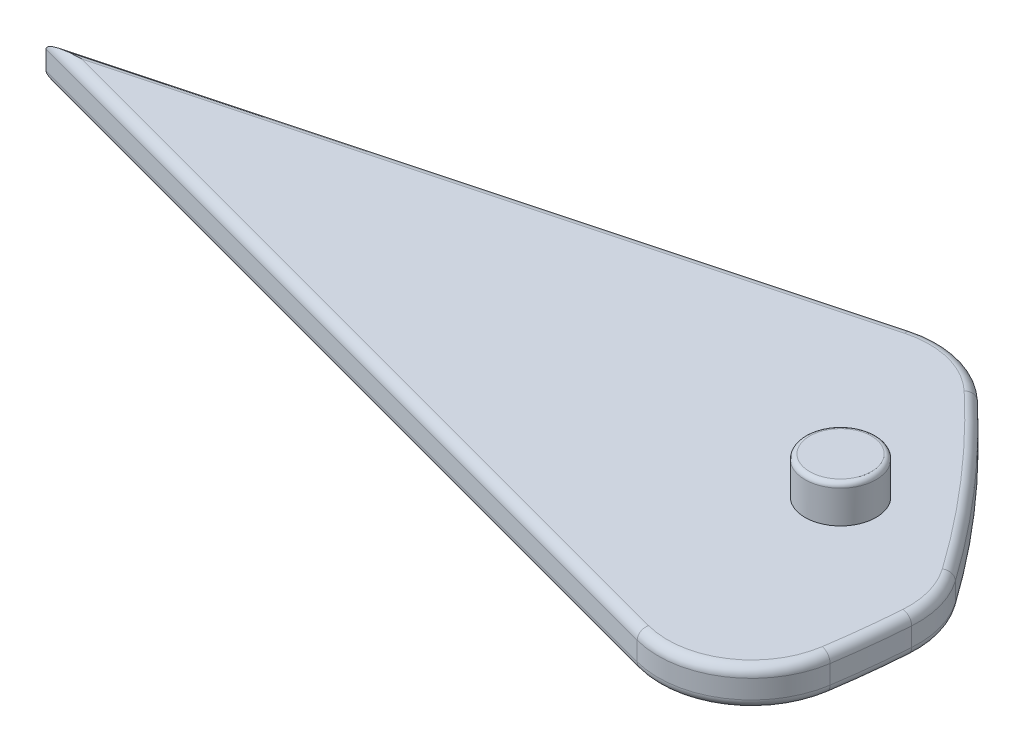
ISO-10303-21;
HEADER;
FILE_DESCRIPTION(('STEP AP214'),'2;1');
FILE_NAME('part.step','',(''),(''),'','','');
FILE_SCHEMA(('AUTOMOTIVE_DESIGN { 1 0 10303 214 1 1 1 1 }'));
ENDSEC;
DATA;
#1=APPLICATION_CONTEXT('core data for automotive mechanical design processes');
#2=APPLICATION_PROTOCOL_DEFINITION('international standard','automotive_design',2000,#1);
#3=PRODUCT_CONTEXT('',#1,'mechanical');
#4=PRODUCT('Part','Part','',(#3));
#5=PRODUCT_RELATED_PRODUCT_CATEGORY('part','',(#4));
#6=PRODUCT_DEFINITION_FORMATION('','',#4);
#7=PRODUCT_DEFINITION_CONTEXT('part definition',#1,'design');
#8=PRODUCT_DEFINITION('design','',#6,#7);
#9=PRODUCT_DEFINITION_SHAPE('','',#8);
#10=(LENGTH_UNIT() NAMED_UNIT(*) SI_UNIT(.MILLI.,.METRE.));
#11=(NAMED_UNIT(*) PLANE_ANGLE_UNIT() SI_UNIT($,.RADIAN.));
#12=(NAMED_UNIT(*) SI_UNIT($,.STERADIAN.) SOLID_ANGLE_UNIT());
#13=UNCERTAINTY_MEASURE_WITH_UNIT(LENGTH_MEASURE(1.E-05),#10,'distance_accuracy_value','');
#14=(GEOMETRIC_REPRESENTATION_CONTEXT(3) GLOBAL_UNCERTAINTY_ASSIGNED_CONTEXT((#13)) GLOBAL_UNIT_ASSIGNED_CONTEXT((#10,
#11,#12)) REPRESENTATION_CONTEXT('',''));
#15=CARTESIAN_POINT('',(0.,0.,0.));
#16=DIRECTION('',(0.,0.,1.));
#17=DIRECTION('',(1.,0.,0.));
#18=AXIS2_PLACEMENT_3D('',#15,#16,#17);
#19=CARTESIAN_POINT('',(0.,-1.,0.));
#20=DIRECTION('',(0.,-1.,0.));
#21=DIRECTION('',(0.,0.,-1.));
#22=AXIS2_PLACEMENT_3D('',#19,#20,#21);
#23=PLANE('',#22);
#24=DIRECTION('',(-0.965925826289068,0.,0.258819045102521));
#25=VECTOR('',#24,1.);
#26=CARTESIAN_POINT('',(36.6352093565327,-1.,-9.29873667142301));
#27=LINE('',#26,#25);
#28=CARTESIAN_POINT('',(1.93185165257814,-1.,0.));
#29=VERTEX_POINT('',#28);
#30=CARTESIAN_POINT('',(36.6352093565327,-1.,-9.29873667142301));
#31=VERTEX_POINT('',#30);
#32=EDGE_CURVE('E230',#29,#31,#27,.F.);
#33=ORIENTED_EDGE('',*,*,#32,.T.);
#34=CARTESIAN_POINT('',(37.799895059494,-1.,-4.95207045312221));
#35=DIRECTION('',(0.,-1.,0.));
#36=DIRECTION('',(0.,0.,-1.));
#37=AXIS2_PLACEMENT_3D('',#34,#35,#36);
#38=CIRCLE('',#37,4.5);
#39=CARTESIAN_POINT('',(40.8926137461799,-1.,-8.22087621746858));
#40=VERTEX_POINT('',#39);
#41=EDGE_CURVE('E242',#31,#40,#38,.T.);
#42=ORIENTED_EDGE('',*,*,#41,.T.);
#43=CARTESIAN_POINT('',(0.,-1.,35.));
#44=DIRECTION('',(0.,-1.,0.));
#45=DIRECTION('',(0.,0.,-1.));
#46=AXIS2_PLACEMENT_3D('',#43,#44,#45);
#47=CIRCLE('',#46,59.5);
#48=CARTESIAN_POINT('',(48.5574710612875,-1.,0.613636363636372));
#49=VERTEX_POINT('',#48);
#50=EDGE_CURVE('E240',#40,#49,#47,.T.);
#51=ORIENTED_EDGE('',*,*,#50,.T.);
#52=CARTESIAN_POINT('',(44.885057283543,-1.,3.21428571428573));
#53=DIRECTION('',(0.,-1.,0.));
#54=DIRECTION('',(0.,0.,-1.));
#55=AXIS2_PLACEMENT_3D('',#52,#53,#54);
#56=CIRCLE('',#55,4.5);
#57=CARTESIAN_POINT('',(49.3735630118973,-1.,3.5357142857143));
#58=VERTEX_POINT('',#57);
#59=EDGE_CURVE('E238',#49,#58,#56,.T.);
#60=ORIENTED_EDGE('',*,*,#59,.T.);
#61=CARTESIAN_POINT('',(0.,-1.,0.));
#62=DIRECTION('',(0.,-1.,0.));
#63=DIRECTION('',(0.,0.,-1.));
#64=AXIS2_PLACEMENT_3D('',#61,#62,#63);
#65=CIRCLE('',#64,49.5);
#66=CARTESIAN_POINT('',(48.9407725417741,-1.,7.41962148726819));
#67=VERTEX_POINT('',#66);
#68=EDGE_CURVE('E236',#58,#67,#65,.T.);
#69=ORIENTED_EDGE('',*,*,#68,.T.);
#70=CARTESIAN_POINT('',(44.4916114016128,-1.,6.74511044297109));
#71=DIRECTION('',(0.,-1.,0.));
#72=DIRECTION('',(0.,0.,-1.));
#73=AXIS2_PLACEMENT_3D('',#70,#71,#72);
#74=CIRCLE('',#73,4.5);
#75=CARTESIAN_POINT('',(43.3269256986515,-1.,11.0917766612719));
#76=VERTEX_POINT('',#75);
#77=EDGE_CURVE('E234',#67,#76,#74,.T.);
#78=ORIENTED_EDGE('',*,*,#77,.T.);
#79=DIRECTION('',(-0.965925826289068,0.,-0.258819045102521));
#80=VECTOR('',#79,1.);
#81=CARTESIAN_POINT('',(0.129409522551261,-1.,-0.482962913144534));
#82=LINE('',#81,#80);
#83=EDGE_CURVE('E232',#76,#29,#82,.T.);
#84=ORIENTED_EDGE('',*,*,#83,.T.);
#85=EDGE_LOOP('',(#33,#42,#51,#60,#69,#78,#84));
#86=FACE_BOUND('',#85,.T.);
#87=DIRECTION('',(0.,0.,-1.));
#88=VECTOR('',#87,1.);
#89=CARTESIAN_POINT('',(37.5,-1.,7.));
#90=LINE('',#89,#88);
#91=CARTESIAN_POINT('',(37.5,-1.,7.));
#92=VERTEX_POINT('',#91);
#93=CARTESIAN_POINT('',(37.5,-1.,-6.99999999999999));
#94=VERTEX_POINT('',#93);
#95=EDGE_CURVE('E681',#92,#94,#90,.T.);
#96=ORIENTED_EDGE('',*,*,#95,.F.);
#97=CARTESIAN_POINT('',(38.,-1.,7.));
#98=DIRECTION('',(0.,-1.,0.));
#99=DIRECTION('',(0.,0.,-1.));
#100=AXIS2_PLACEMENT_3D('',#97,#98,#99);
#101=CIRCLE('',#100,0.5);
#102=CARTESIAN_POINT('',(38.5,-1.,7.));
#103=VERTEX_POINT('',#102);
#104=EDGE_CURVE('E184',#103,#92,#101,.T.);
#105=ORIENTED_EDGE('',*,*,#104,.F.);
#106=DIRECTION('',(0.,0.,1.));
#107=VECTOR('',#106,1.);
#108=CARTESIAN_POINT('',(38.5,-1.,7.));
#109=LINE('',#108,#107);
#110=CARTESIAN_POINT('',(38.5,-1.,-6.99999999999999));
#111=VERTEX_POINT('',#110);
#112=EDGE_CURVE('E180',#111,#103,#109,.T.);
#113=ORIENTED_EDGE('',*,*,#112,.F.);
#114=CARTESIAN_POINT('',(38.,-1.,-6.99999999999999));
#115=DIRECTION('',(0.,-1.,0.));
#116=DIRECTION('',(0.,0.,-1.));
#117=AXIS2_PLACEMENT_3D('',#114,#115,#116);
#118=CIRCLE('',#117,0.5);
#119=EDGE_CURVE('E679',#94,#111,#118,.T.);
#120=ORIENTED_EDGE('',*,*,#119,.F.);
#121=EDGE_LOOP('',(#96,#105,#113,#120));
#122=FACE_BOUND('',#121,.T.);
#123=ADVANCED_FACE('F34',(#86,#122),#23,.T.);
#124=CARTESIAN_POINT('',(0.,1.,0.));
#125=DIRECTION('',(0.,-1.,0.));
#126=DIRECTION('',(0.,0.,-1.));
#127=AXIS2_PLACEMENT_3D('',#124,#125,#126);
#128=PLANE('',#127);
#129=CARTESIAN_POINT('',(42.5,1.,0.));
#130=DIRECTION('',(0.,-1.,0.));
#131=DIRECTION('',(0.,0.,-1.));
#132=AXIS2_PLACEMENT_3D('',#129,#130,#131);
#133=CIRCLE('',#132,1.9);
#134=CARTESIAN_POINT('',(42.5,1.,-1.9));
#135=VERTEX_POINT('',#134);
#136=EDGE_CURVE('E267',#135,#135,#133,.F.);
#137=ORIENTED_EDGE('',*,*,#136,.F.);
#138=EDGE_LOOP('',(#137));
#139=FACE_BOUND('',#138,.T.);
#140=CARTESIAN_POINT('',(0.,1.,35.));
#141=DIRECTION('',(0.,-1.,0.));
#142=DIRECTION('',(0.,0.,-1.));
#143=AXIS2_PLACEMENT_3D('',#140,#141,#142);
#144=CIRCLE('',#143,59.5);
#145=CARTESIAN_POINT('',(48.5574710612875,1.,0.613636363636372));
#146=VERTEX_POINT('',#145);
#147=CARTESIAN_POINT('',(40.8926137461799,1.,-8.22087621746858));
#148=VERTEX_POINT('',#147);
#149=EDGE_CURVE('E217',#146,#148,#144,.F.);
#150=ORIENTED_EDGE('',*,*,#149,.T.);
#151=CARTESIAN_POINT('',(37.799895059494,1.,-4.95207045312221));
#152=DIRECTION('',(0.,-1.,0.));
#153=DIRECTION('',(0.,0.,-1.));
#154=AXIS2_PLACEMENT_3D('',#151,#152,#153);
#155=CIRCLE('',#154,4.5);
#156=CARTESIAN_POINT('',(36.6352093565327,1.,-9.29873667142301));
#157=VERTEX_POINT('',#156);
#158=EDGE_CURVE('E221',#148,#157,#155,.F.);
#159=ORIENTED_EDGE('',*,*,#158,.T.);
#160=DIRECTION('',(-0.965925826289068,0.,0.258819045102521));
#161=VECTOR('',#160,1.);
#162=CARTESIAN_POINT('',(0.129409522551261,1.,0.482962913144534));
#163=LINE('',#162,#161);
#164=CARTESIAN_POINT('',(1.93185165257814,1.,0.));
#165=VERTEX_POINT('',#164);
#166=EDGE_CURVE('E219',#157,#165,#163,.T.);
#167=ORIENTED_EDGE('',*,*,#166,.T.);
#168=DIRECTION('',(-0.965925826289068,0.,-0.258819045102521));
#169=VECTOR('',#168,1.);
#170=CARTESIAN_POINT('',(43.3269256986515,1.,11.0917766612719));
#171=LINE('',#170,#169);
#172=CARTESIAN_POINT('',(43.3269256986515,1.,11.0917766612719));
#173=VERTEX_POINT('',#172);
#174=EDGE_CURVE('E209',#165,#173,#171,.F.);
#175=ORIENTED_EDGE('',*,*,#174,.T.);
#176=CARTESIAN_POINT('',(44.4916114016128,1.,6.74511044297109));
#177=DIRECTION('',(0.,-1.,0.));
#178=DIRECTION('',(0.,0.,-1.));
#179=AXIS2_PLACEMENT_3D('',#176,#177,#178);
#180=CIRCLE('',#179,4.5);
#181=CARTESIAN_POINT('',(48.9407725417741,1.,7.41962148726819));
#182=VERTEX_POINT('',#181);
#183=EDGE_CURVE('E211',#173,#182,#180,.F.);
#184=ORIENTED_EDGE('',*,*,#183,.T.);
#185=CARTESIAN_POINT('',(0.,1.,0.));
#186=DIRECTION('',(0.,-1.,0.));
#187=DIRECTION('',(0.,0.,-1.));
#188=AXIS2_PLACEMENT_3D('',#185,#186,#187);
#189=CIRCLE('',#188,49.5);
#190=CARTESIAN_POINT('',(49.3735630118973,1.,3.5357142857143));
#191=VERTEX_POINT('',#190);
#192=EDGE_CURVE('E213',#182,#191,#189,.F.);
#193=ORIENTED_EDGE('',*,*,#192,.T.);
#194=CARTESIAN_POINT('',(44.885057283543,1.,3.21428571428573));
#195=DIRECTION('',(0.,-1.,0.));
#196=DIRECTION('',(0.,0.,-1.));
#197=AXIS2_PLACEMENT_3D('',#194,#195,#196);
#198=CIRCLE('',#197,4.5);
#199=EDGE_CURVE('E215',#191,#146,#198,.F.);
#200=ORIENTED_EDGE('',*,*,#199,.T.);
#201=EDGE_LOOP('',(#150,#159,#167,#175,#184,#193,#200));
#202=FACE_BOUND('',#201,.T.);
#203=ADVANCED_FACE('F321',(#139,#202),#128,.F.);
#204=CARTESIAN_POINT('',(48.2962913144534,1.,-12.9409522551261));
#205=DIRECTION('',(0.258819045102521,0.,0.965925826289068));
#206=DIRECTION('',(0.965925826289068,0.,-0.258819045102521));
#207=AXIS2_PLACEMENT_3D('',#204,#205,#206);
#208=PLANE('',#207);
#209=DIRECTION('',(0.,-1.,0.));
#210=VECTOR('',#209,1.);
#211=CARTESIAN_POINT('',(36.5057998339814,-1.,-9.78169958456754));
#212=LINE('',#211,#210);
#213=CARTESIAN_POINT('',(36.5057998339814,0.5,-9.78169958456754));
#214=VERTEX_POINT('',#213);
#215=CARTESIAN_POINT('',(36.5057998339814,-0.5,-9.78169958456754));
#216=VERTEX_POINT('',#215);
#217=EDGE_CURVE('E188',#214,#216,#212,.T.);
#218=ORIENTED_EDGE('',*,*,#217,.T.);
#219=DIRECTION('',(-0.965925826289068,0.,0.258819045102521));
#220=VECTOR('',#219,1.);
#221=CARTESIAN_POINT('',(0.,-0.5,0.));
#222=LINE('',#221,#220);
#223=CARTESIAN_POINT('',(0.,-0.5,0.));
#224=VERTEX_POINT('',#223);
#225=EDGE_CURVE('E49',#216,#224,#222,.T.);
#226=ORIENTED_EDGE('',*,*,#225,.T.);
#227=DIRECTION('',(0.,-1.,0.));
#228=VECTOR('',#227,1.);
#229=CARTESIAN_POINT('',(0.,1.,0.));
#230=LINE('',#229,#228);
#231=CARTESIAN_POINT('',(0.,0.5,0.));
#232=VERTEX_POINT('',#231);
#233=EDGE_CURVE('E186',#232,#224,#230,.T.);
#234=ORIENTED_EDGE('',*,*,#233,.F.);
#235=DIRECTION('',(-0.965925826289068,0.,0.258819045102521));
#236=VECTOR('',#235,1.);
#237=CARTESIAN_POINT('',(48.2962913144534,0.5,-12.9409522551261));
#238=LINE('',#237,#236);
#239=EDGE_CURVE('E264',#232,#214,#238,.F.);
#240=ORIENTED_EDGE('',*,*,#239,.T.);
#241=EDGE_LOOP('',(#218,#226,#234,#240));
#242=FACE_BOUND('',#241,.T.);
#243=ADVANCED_FACE('F327',(#242),#208,.F.);
#244=CARTESIAN_POINT('',(48.2962913144534,1.,12.9409522551261));
#245=DIRECTION('',(-0.258819045102521,0.,0.965925826289068));
#246=DIRECTION('',(0.965925826289068,0.,0.258819045102521));
#247=AXIS2_PLACEMENT_3D('',#244,#245,#246);
#248=PLANE('',#247);
#249=ORIENTED_EDGE('',*,*,#233,.T.);
#250=DIRECTION('',(-0.965925826289068,0.,-0.258819045102521));
#251=VECTOR('',#250,1.);
#252=CARTESIAN_POINT('',(48.2962913144534,-0.5,12.9409522551261));
#253=LINE('',#252,#251);
#254=CARTESIAN_POINT('',(43.1975161761002,-0.5,11.5747395744164));
#255=VERTEX_POINT('',#254);
#256=EDGE_CURVE('E262',#224,#255,#253,.F.);
#257=ORIENTED_EDGE('',*,*,#256,.T.);
#258=DIRECTION('',(0.,-1.,0.));
#259=VECTOR('',#258,1.);
#260=CARTESIAN_POINT('',(43.1975161761002,1.,11.5747395744164));
#261=LINE('',#260,#259);
#262=CARTESIAN_POINT('',(43.1975161761002,0.5,11.5747395744164));
#263=VERTEX_POINT('',#262);
#264=EDGE_CURVE('E207',#255,#263,#261,.F.);
#265=ORIENTED_EDGE('',*,*,#264,.T.);
#266=DIRECTION('',(-0.965925826289068,0.,-0.258819045102521));
#267=VECTOR('',#266,1.);
#268=CARTESIAN_POINT('',(0.,0.5,0.));
#269=LINE('',#268,#267);
#270=EDGE_CURVE('E56',#263,#232,#269,.T.);
#271=ORIENTED_EDGE('',*,*,#270,.T.);
#272=EDGE_LOOP('',(#249,#257,#265,#271));
#273=FACE_BOUND('',#272,.T.);
#274=ADVANCED_FACE('F336',(#273),#248,.T.);
#275=CARTESIAN_POINT('',(0.,1.,0.));
#276=DIRECTION('',(0.,-1.,0.));
#277=DIRECTION('',(0.,0.,-1.));
#278=AXIS2_PLACEMENT_3D('',#275,#276,#277);
#279=CYLINDRICAL_SURFACE('',#278,50.);
#280=DIRECTION('',(0.,-1.,0.));
#281=VECTOR('',#280,1.);
#282=CARTESIAN_POINT('',(49.4351237795698,1.,7.49456715885676));
#283=LINE('',#282,#281);
#284=CARTESIAN_POINT('',(49.4351237795698,0.5,7.49456715885676));
#285=VERTEX_POINT('',#284);
#286=CARTESIAN_POINT('',(49.4351237795698,-0.5,7.49456715885676));
#287=VERTEX_POINT('',#286);
#288=EDGE_CURVE('E201',#285,#287,#283,.T.);
#289=ORIENTED_EDGE('',*,*,#288,.T.);
#290=CARTESIAN_POINT('',(0.,-0.5,0.));
#291=DIRECTION('',(0.,-1.,0.));
#292=DIRECTION('',(0.,0.,-1.));
#293=AXIS2_PLACEMENT_3D('',#290,#291,#292);
#294=CIRCLE('',#293,50.);
#295=CARTESIAN_POINT('',(49.8722858706034,-0.5,3.57142857142858));
#296=VERTEX_POINT('',#295);
#297=EDGE_CURVE('E255',#287,#296,#294,.F.);
#298=ORIENTED_EDGE('',*,*,#297,.T.);
#299=DIRECTION('',(0.,-1.,0.));
#300=VECTOR('',#299,1.);
#301=CARTESIAN_POINT('',(49.8722858706034,1.,3.57142857142858));
#302=LINE('',#301,#300);
#303=CARTESIAN_POINT('',(49.8722858706034,0.5,3.57142857142858));
#304=VERTEX_POINT('',#303);
#305=EDGE_CURVE('E204',#296,#304,#302,.F.);
#306=ORIENTED_EDGE('',*,*,#305,.T.);
#307=CARTESIAN_POINT('',(0.,0.5,0.));
#308=DIRECTION('',(0.,-1.,0.));
#309=DIRECTION('',(0.,0.,-1.));
#310=AXIS2_PLACEMENT_3D('',#307,#308,#309);
#311=CIRCLE('',#310,50.);
#312=EDGE_CURVE('E253',#304,#285,#311,.T.);
#313=ORIENTED_EDGE('',*,*,#312,.T.);
#314=EDGE_LOOP('',(#289,#298,#306,#313));
#315=FACE_BOUND('',#314,.T.);
#316=ADVANCED_FACE('F333',(#315),#279,.T.);
#317=CARTESIAN_POINT('',(38.,-2.,7.));
#318=DIRECTION('',(0.,1.,0.));
#319=DIRECTION('',(0.,0.,1.));
#320=AXIS2_PLACEMENT_3D('',#317,#318,#319);
#321=CYLINDRICAL_SURFACE('',#320,0.5);
#322=ORIENTED_EDGE('',*,*,#104,.T.);
#323=DIRECTION('',(0.,1.,0.));
#324=VECTOR('',#323,1.);
#325=CARTESIAN_POINT('',(37.5,-2.,7.));
#326=LINE('',#325,#324);
#327=CARTESIAN_POINT('',(37.5,-2.,7.));
#328=VERTEX_POINT('',#327);
#329=EDGE_CURVE('E164',#328,#92,#326,.T.);
#330=ORIENTED_EDGE('',*,*,#329,.F.);
#331=CARTESIAN_POINT('',(38.,-2.,7.));
#332=DIRECTION('',(0.,-1.,0.));
#333=DIRECTION('',(0.,0.,-1.));
#334=AXIS2_PLACEMENT_3D('',#331,#332,#333);
#335=CIRCLE('',#334,0.5);
#336=CARTESIAN_POINT('',(38.5,-2.,7.));
#337=VERTEX_POINT('',#336);
#338=EDGE_CURVE('E171',#337,#328,#335,.T.);
#339=ORIENTED_EDGE('',*,*,#338,.F.);
#340=DIRECTION('',(0.,1.,0.));
#341=VECTOR('',#340,1.);
#342=CARTESIAN_POINT('',(38.5,-2.,7.));
#343=LINE('',#342,#341);
#344=EDGE_CURVE('E686',#337,#103,#343,.T.);
#345=ORIENTED_EDGE('',*,*,#344,.T.);
#346=EDGE_LOOP('',(#322,#330,#339,#345));
#347=FACE_BOUND('',#346,.T.);
#348=ADVANCED_FACE('F182',(#347),#321,.T.);
#349=CARTESIAN_POINT('',(37.5,-2.,7.));
#350=DIRECTION('',(1.,0.,0.));
#351=DIRECTION('',(0.,0.,-1.));
#352=AXIS2_PLACEMENT_3D('',#349,#350,#351);
#353=PLANE('',#352);
#354=ORIENTED_EDGE('',*,*,#95,.T.);
#355=DIRECTION('',(0.,1.,0.));
#356=VECTOR('',#355,1.);
#357=CARTESIAN_POINT('',(37.5,-2.,-6.99999999999999));
#358=LINE('',#357,#356);
#359=CARTESIAN_POINT('',(37.5,-2.,-6.99999999999999));
#360=VERTEX_POINT('',#359);
#361=EDGE_CURVE('E167',#360,#94,#358,.T.);
#362=ORIENTED_EDGE('',*,*,#361,.F.);
#363=DIRECTION('',(0.,0.,-1.));
#364=VECTOR('',#363,1.);
#365=CARTESIAN_POINT('',(37.5,-2.,7.));
#366=LINE('',#365,#364);
#367=EDGE_CURVE('E160',#328,#360,#366,.T.);
#368=ORIENTED_EDGE('',*,*,#367,.F.);
#369=ORIENTED_EDGE('',*,*,#329,.T.);
#370=EDGE_LOOP('',(#354,#362,#368,#369));
#371=FACE_BOUND('',#370,.T.);
#372=ADVANCED_FACE('F162',(#371),#353,.F.);
#373=CARTESIAN_POINT('',(38.,-2.,-6.99999999999999));
#374=DIRECTION('',(0.,1.,0.));
#375=DIRECTION('',(0.,0.,1.));
#376=AXIS2_PLACEMENT_3D('',#373,#374,#375);
#377=CYLINDRICAL_SURFACE('',#376,0.5);
#378=ORIENTED_EDGE('',*,*,#119,.T.);
#379=DIRECTION('',(0.,1.,0.));
#380=VECTOR('',#379,1.);
#381=CARTESIAN_POINT('',(38.5,-2.,-6.99999999999999));
#382=LINE('',#381,#380);
#383=CARTESIAN_POINT('',(38.5,-2.,-6.99999999999999));
#384=VERTEX_POINT('',#383);
#385=EDGE_CURVE('E190',#384,#111,#382,.T.);
#386=ORIENTED_EDGE('',*,*,#385,.F.);
#387=CARTESIAN_POINT('',(38.,-2.,-6.99999999999999));
#388=DIRECTION('',(0.,-1.,0.));
#389=DIRECTION('',(0.,0.,-1.));
#390=AXIS2_PLACEMENT_3D('',#387,#388,#389);
#391=CIRCLE('',#390,0.5);
#392=EDGE_CURVE('E170',#360,#384,#391,.T.);
#393=ORIENTED_EDGE('',*,*,#392,.F.);
#394=ORIENTED_EDGE('',*,*,#361,.T.);
#395=EDGE_LOOP('',(#378,#386,#393,#394));
#396=FACE_BOUND('',#395,.T.);
#397=ADVANCED_FACE('F470',(#396),#377,.T.);
#398=CARTESIAN_POINT('',(38.5,-2.,7.));
#399=DIRECTION('',(-1.,0.,0.));
#400=DIRECTION('',(0.,0.,1.));
#401=AXIS2_PLACEMENT_3D('',#398,#399,#400);
#402=PLANE('',#401);
#403=ORIENTED_EDGE('',*,*,#112,.T.);
#404=ORIENTED_EDGE('',*,*,#344,.F.);
#405=DIRECTION('',(0.,0.,1.));
#406=VECTOR('',#405,1.);
#407=CARTESIAN_POINT('',(38.5,-2.,7.));
#408=LINE('',#407,#406);
#409=EDGE_CURVE('E176',#384,#337,#408,.T.);
#410=ORIENTED_EDGE('',*,*,#409,.F.);
#411=ORIENTED_EDGE('',*,*,#385,.T.);
#412=EDGE_LOOP('',(#403,#404,#410,#411));
#413=FACE_BOUND('',#412,.T.);
#414=ADVANCED_FACE('F464',(#413),#402,.F.);
#415=CARTESIAN_POINT('',(38.,-2.,7.));
#416=DIRECTION('',(0.,-1.,0.));
#417=DIRECTION('',(0.,0.,-1.));
#418=AXIS2_PLACEMENT_3D('',#415,#416,#417);
#419=PLANE('',#418);
#420=ORIENTED_EDGE('',*,*,#338,.T.);
#421=ORIENTED_EDGE('',*,*,#367,.T.);
#422=ORIENTED_EDGE('',*,*,#392,.T.);
#423=ORIENTED_EDGE('',*,*,#409,.T.);
#424=EDGE_LOOP('',(#420,#421,#422,#423));
#425=FACE_BOUND('',#424,.T.);
#426=ADVANCED_FACE('F174',(#425),#419,.T.);
#427=CARTESIAN_POINT('',(0.,-2.001,35.));
#428=DIRECTION('',(0.,1.,0.));
#429=DIRECTION('',(0.,0.,1.));
#430=AXIS2_PLACEMENT_3D('',#427,#428,#429);
#431=CYLINDRICAL_SURFACE('',#430,60.);
#432=DIRECTION('',(0.,1.,0.));
#433=VECTOR('',#432,1.);
#434=CARTESIAN_POINT('',(48.9655170365924,-2.001,0.324675324675332));
#435=LINE('',#434,#433);
#436=CARTESIAN_POINT('',(48.9655170365924,0.499999999999999,0.324675324675332));
#437=VERTEX_POINT('',#436);
#438=CARTESIAN_POINT('',(48.9655170365924,-0.5,0.324675324675332));
#439=VERTEX_POINT('',#438);
#440=EDGE_CURVE('E195',#437,#439,#435,.F.);
#441=ORIENTED_EDGE('',*,*,#440,.T.);
#442=CARTESIAN_POINT('',(0.,-0.5,35.));
#443=DIRECTION('',(0.,-1.,0.));
#444=DIRECTION('',(0.,0.,-1.));
#445=AXIS2_PLACEMENT_3D('',#442,#443,#444);
#446=CIRCLE('',#445,60.);
#447=CARTESIAN_POINT('',(41.2362491558116,-0.5,-8.5840768579515));
#448=VERTEX_POINT('',#447);
#449=EDGE_CURVE('E247',#439,#448,#446,.F.);
#450=ORIENTED_EDGE('',*,*,#449,.T.);
#451=DIRECTION('',(0.,1.,0.));
#452=VECTOR('',#451,1.);
#453=CARTESIAN_POINT('',(41.2362491558116,-2.001,-8.5840768579515));
#454=LINE('',#453,#452);
#455=CARTESIAN_POINT('',(41.2362491558116,0.499999999999999,-8.5840768579515));
#456=VERTEX_POINT('',#455);
#457=EDGE_CURVE('E198',#448,#456,#454,.T.);
#458=ORIENTED_EDGE('',*,*,#457,.T.);
#459=CARTESIAN_POINT('',(0.,0.5,35.));
#460=DIRECTION('',(0.,-1.,0.));
#461=DIRECTION('',(0.,0.,-1.));
#462=AXIS2_PLACEMENT_3D('',#459,#460,#461);
#463=CIRCLE('',#462,60.);
#464=EDGE_CURVE('E245',#456,#437,#463,.T.);
#465=ORIENTED_EDGE('',*,*,#464,.T.);
#466=EDGE_LOOP('',(#441,#450,#458,#465));
#467=FACE_BOUND('',#466,.T.);
#468=ADVANCED_FACE('F346',(#467),#431,.T.);
#469=CARTESIAN_POINT('',(37.799895059494,-2.001,-4.95207045312221));
#470=DIRECTION('',(0.,1.,0.));
#471=DIRECTION('',(0.,0.,1.));
#472=AXIS2_PLACEMENT_3D('',#469,#470,#471);
#473=CYLINDRICAL_SURFACE('',#472,5.);
#474=ORIENTED_EDGE('',*,*,#217,.F.);
#475=CARTESIAN_POINT('',(37.799895059494,0.5,-4.95207045312221));
#476=DIRECTION('',(0.,-1.,0.));
#477=DIRECTION('',(0.,0.,-1.));
#478=AXIS2_PLACEMENT_3D('',#475,#476,#477);
#479=CIRCLE('',#478,5.);
#480=EDGE_CURVE('E227',#214,#456,#479,.T.);
#481=ORIENTED_EDGE('',*,*,#480,.T.);
#482=ORIENTED_EDGE('',*,*,#457,.F.);
#483=CARTESIAN_POINT('',(37.799895059494,-0.5,-4.95207045312221));
#484=DIRECTION('',(0.,-1.,0.));
#485=DIRECTION('',(0.,0.,-1.));
#486=AXIS2_PLACEMENT_3D('',#483,#484,#485);
#487=CIRCLE('',#486,5.);
#488=EDGE_CURVE('E224',#448,#216,#487,.F.);
#489=ORIENTED_EDGE('',*,*,#488,.T.);
#490=EDGE_LOOP('',(#474,#481,#482,#489));
#491=FACE_BOUND('',#490,.T.);
#492=ADVANCED_FACE('F342',(#491),#473,.T.);
#493=CARTESIAN_POINT('',(44.885057283543,1.,3.21428571428573));
#494=DIRECTION('',(0.,-1.,0.));
#495=DIRECTION('',(0.,0.,-1.));
#496=AXIS2_PLACEMENT_3D('',#493,#494,#495);
#497=CYLINDRICAL_SURFACE('',#496,5.);
#498=ORIENTED_EDGE('',*,*,#305,.F.);
#499=CARTESIAN_POINT('',(44.885057283543,-0.5,3.21428571428573));
#500=DIRECTION('',(0.,-1.,0.));
#501=DIRECTION('',(0.,0.,-1.));
#502=AXIS2_PLACEMENT_3D('',#499,#500,#501);
#503=CIRCLE('',#502,5.);
#504=EDGE_CURVE('E251',#296,#439,#503,.F.);
#505=ORIENTED_EDGE('',*,*,#504,.T.);
#506=ORIENTED_EDGE('',*,*,#440,.F.);
#507=CARTESIAN_POINT('',(44.885057283543,0.5,3.21428571428573));
#508=DIRECTION('',(0.,-1.,0.));
#509=DIRECTION('',(0.,0.,-1.));
#510=AXIS2_PLACEMENT_3D('',#507,#508,#509);
#511=CIRCLE('',#510,5.);
#512=EDGE_CURVE('E249',#437,#304,#511,.T.);
#513=ORIENTED_EDGE('',*,*,#512,.T.);
#514=EDGE_LOOP('',(#498,#505,#506,#513));
#515=FACE_BOUND('',#514,.T.);
#516=ADVANCED_FACE('F345',(#515),#497,.T.);
#517=CARTESIAN_POINT('',(44.4916114016128,1.,6.74511044297109));
#518=DIRECTION('',(0.,-1.,0.));
#519=DIRECTION('',(0.,0.,-1.));
#520=AXIS2_PLACEMENT_3D('',#517,#518,#519);
#521=CYLINDRICAL_SURFACE('',#520,5.);
#522=ORIENTED_EDGE('',*,*,#264,.F.);
#523=CARTESIAN_POINT('',(44.4916114016128,-0.5,6.74511044297109));
#524=DIRECTION('',(0.,-1.,0.));
#525=DIRECTION('',(0.,0.,-1.));
#526=AXIS2_PLACEMENT_3D('',#523,#524,#525);
#527=CIRCLE('',#526,5.);
#528=EDGE_CURVE('E259',#255,#287,#527,.F.);
#529=ORIENTED_EDGE('',*,*,#528,.T.);
#530=ORIENTED_EDGE('',*,*,#288,.F.);
#531=CARTESIAN_POINT('',(44.4916114016128,0.5,6.74511044297109));
#532=DIRECTION('',(0.,-1.,0.));
#533=DIRECTION('',(0.,0.,-1.));
#534=AXIS2_PLACEMENT_3D('',#531,#532,#533);
#535=CIRCLE('',#534,5.);
#536=EDGE_CURVE('E257',#285,#263,#535,.T.);
#537=ORIENTED_EDGE('',*,*,#536,.T.);
#538=EDGE_LOOP('',(#522,#529,#530,#537));
#539=FACE_BOUND('',#538,.T.);
#540=ADVANCED_FACE('F350',(#539),#521,.T.);
#541=CARTESIAN_POINT('',(0.,0.5,0.));
#542=DIRECTION('',(0.,-1.,0.));
#543=DIRECTION('',(0.,0.,-1.));
#544=AXIS2_PLACEMENT_3D('',#541,#542,#543);
#545=TOROIDAL_SURFACE('',#544,49.5,0.5);
#546=CARTESIAN_POINT('',(49.3735630118973,0.5,3.5357142857143));
#547=DIRECTION('',(0.0714285714285716,0.,-0.997445717412067));
#548=DIRECTION('',(-0.997445717412067,0.,-0.0714285714285716));
#549=AXIS2_PLACEMENT_3D('',#546,#547,#548);
#550=CIRCLE('',#549,0.5);
#551=EDGE_CURVE('E282',#191,#304,#550,.T.);
#552=ORIENTED_EDGE('',*,*,#551,.F.);
#553=ORIENTED_EDGE('',*,*,#192,.F.);
#554=CARTESIAN_POINT('',(48.9407725417741,0.5,7.41962148726819));
#555=DIRECTION('',(-0.149891343177136,0.,0.988702475591396));
#556=DIRECTION('',(0.988702475591396,0.,0.149891343177136));
#557=AXIS2_PLACEMENT_3D('',#554,#555,#556);
#558=CIRCLE('',#557,0.5);
#559=EDGE_CURVE('E285',#285,#182,#558,.T.);
#560=ORIENTED_EDGE('',*,*,#559,.F.);
#561=ORIENTED_EDGE('',*,*,#312,.F.);
#562=EDGE_LOOP('',(#552,#553,#560,#561));
#563=FACE_BOUND('',#562,.T.);
#564=ADVANCED_FACE('F354',(#563),#545,.T.);
#565=CARTESIAN_POINT('',(44.4916114016128,0.5,6.74511044297109));
#566=DIRECTION('',(0.,-1.,0.));
#567=DIRECTION('',(0.,0.,-1.));
#568=AXIS2_PLACEMENT_3D('',#565,#566,#567);
#569=TOROIDAL_SURFACE('',#568,4.5,0.5);
#570=ORIENTED_EDGE('',*,*,#559,.T.);
#571=ORIENTED_EDGE('',*,*,#183,.F.);
#572=CARTESIAN_POINT('',(43.3269256986515,0.5,11.0917766612719));
#573=DIRECTION('',(-0.965925826289067,0.,-0.258819045102526));
#574=DIRECTION('',(-0.258819045102526,0.,0.965925826289067));
#575=AXIS2_PLACEMENT_3D('',#572,#573,#574);
#576=CIRCLE('',#575,0.5);
#577=EDGE_CURVE('E279',#263,#173,#576,.T.);
#578=ORIENTED_EDGE('',*,*,#577,.F.);
#579=ORIENTED_EDGE('',*,*,#536,.F.);
#580=EDGE_LOOP('',(#570,#571,#578,#579));
#581=FACE_BOUND('',#580,.T.);
#582=ADVANCED_FACE('F376',(#581),#569,.T.);
#583=CARTESIAN_POINT('',(44.885057283543,0.5,3.21428571428573));
#584=DIRECTION('',(0.,-1.,0.));
#585=DIRECTION('',(0.,0.,-1.));
#586=AXIS2_PLACEMENT_3D('',#583,#584,#585);
#587=TOROIDAL_SURFACE('',#586,4.5,0.5);
#588=ORIENTED_EDGE('',*,*,#551,.T.);
#589=ORIENTED_EDGE('',*,*,#512,.F.);
#590=CARTESIAN_POINT('',(48.5574710612875,0.5,0.613636363636372));
#591=DIRECTION('',(-0.577922077922077,0.,-0.816091950609874));
#592=DIRECTION('',(-0.816091950609874,0.,0.577922077922077));
#593=AXIS2_PLACEMENT_3D('',#590,#591,#592);
#594=CIRCLE('',#593,0.5);
#595=EDGE_CURVE('E276',#146,#437,#594,.T.);
#596=ORIENTED_EDGE('',*,*,#595,.F.);
#597=ORIENTED_EDGE('',*,*,#199,.F.);
#598=EDGE_LOOP('',(#588,#589,#596,#597));
#599=FACE_BOUND('',#598,.T.);
#600=ADVANCED_FACE('F372',(#599),#587,.T.);
#601=CARTESIAN_POINT('',(48.4257008370047,0.5,12.4579893419815));
#602=DIRECTION('',(0.965925826289068,0.,0.258819045102521));
#603=DIRECTION('',(0.258819045102521,0.,-0.965925826289068));
#604=AXIS2_PLACEMENT_3D('',#601,#602,#603);
#605=CYLINDRICAL_SURFACE('',#604,0.5);
#606=ORIENTED_EDGE('',*,*,#577,.T.);
#607=ORIENTED_EDGE('',*,*,#174,.F.);
#608=CARTESIAN_POINT('',(1.93185165257819,0.5,0.));
#609=DIRECTION('',(0.,0.,1.));
#610=DIRECTION('',(1.,0.,0.));
#611=AXIS2_PLACEMENT_3D('',#608,#609,#610);
#612=ELLIPSE('',#611,1.93185165257814,0.5);
#613=EDGE_CURVE('E273',#232,#165,#612,.F.);
#614=ORIENTED_EDGE('',*,*,#613,.F.);
#615=ORIENTED_EDGE('',*,*,#270,.F.);
#616=EDGE_LOOP('',(#606,#607,#614,#615));
#617=FACE_BOUND('',#616,.T.);
#618=ADVANCED_FACE('F368',(#617),#605,.T.);
#619=CARTESIAN_POINT('',(0.,0.5,35.));
#620=DIRECTION('',(0.,-1.,0.));
#621=DIRECTION('',(0.,0.,-1.));
#622=AXIS2_PLACEMENT_3D('',#619,#620,#621);
#623=TOROIDAL_SURFACE('',#622,59.5,0.5);
#624=ORIENTED_EDGE('',*,*,#595,.T.);
#625=ORIENTED_EDGE('',*,*,#464,.F.);
#626=CARTESIAN_POINT('',(40.8926137461799,0.5,-8.22087621746858));
#627=DIRECTION('',(-0.726401280965862,0.,-0.687270819263524));
#628=DIRECTION('',(-0.687270819263524,0.,0.726401280965862));
#629=AXIS2_PLACEMENT_3D('',#626,#627,#628);
#630=CIRCLE('',#629,0.5);
#631=EDGE_CURVE('E270',#148,#456,#630,.T.);
#632=ORIENTED_EDGE('',*,*,#631,.F.);
#633=ORIENTED_EDGE('',*,*,#149,.F.);
#634=EDGE_LOOP('',(#624,#625,#632,#633));
#635=FACE_BOUND('',#634,.T.);
#636=ADVANCED_FACE('F364',(#635),#623,.T.);
#637=CARTESIAN_POINT('',(0.129409522551261,0.5,0.482962913144534));
#638=DIRECTION('',(-0.965925826289068,0.,0.258819045102521));
#639=DIRECTION('',(0.258819045102521,0.,0.965925826289068));
#640=AXIS2_PLACEMENT_3D('',#637,#638,#639);
#641=CYLINDRICAL_SURFACE('',#640,0.5);
#642=ORIENTED_EDGE('',*,*,#613,.T.);
#643=ORIENTED_EDGE('',*,*,#166,.F.);
#644=CARTESIAN_POINT('',(36.6352093565327,0.5,-9.29873667142301));
#645=DIRECTION('',(0.965925826289067,0.,-0.258819045102526));
#646=DIRECTION('',(-0.258819045102526,0.,-0.965925826289067));
#647=AXIS2_PLACEMENT_3D('',#644,#645,#646);
#648=CIRCLE('',#647,0.5);
#649=EDGE_CURVE('E268',#214,#157,#648,.T.);
#650=ORIENTED_EDGE('',*,*,#649,.F.);
#651=ORIENTED_EDGE('',*,*,#239,.F.);
#652=EDGE_LOOP('',(#642,#643,#650,#651));
#653=FACE_BOUND('',#652,.T.);
#654=ADVANCED_FACE('F360',(#653),#641,.T.);
#655=CARTESIAN_POINT('',(37.799895059494,0.5,-4.95207045312221));
#656=DIRECTION('',(0.,-1.,0.));
#657=DIRECTION('',(0.,0.,-1.));
#658=AXIS2_PLACEMENT_3D('',#655,#656,#657);
#659=TOROIDAL_SURFACE('',#658,4.5,0.5);
#660=ORIENTED_EDGE('',*,*,#631,.T.);
#661=ORIENTED_EDGE('',*,*,#480,.F.);
#662=ORIENTED_EDGE('',*,*,#649,.T.);
#663=ORIENTED_EDGE('',*,*,#158,.F.);
#664=EDGE_LOOP('',(#660,#661,#662,#663));
#665=FACE_BOUND('',#664,.T.);
#666=ADVANCED_FACE('F356',(#665),#659,.T.);
#667=CARTESIAN_POINT('',(44.4916114016128,-0.5,6.74511044297109));
#668=DIRECTION('',(0.,-1.,0.));
#669=DIRECTION('',(0.,0.,-1.));
#670=AXIS2_PLACEMENT_3D('',#667,#668,#669);
#671=TOROIDAL_SURFACE('',#670,4.5,0.5);
#672=CARTESIAN_POINT('',(43.3269256986515,-0.5,11.0917766612719));
#673=DIRECTION('',(-0.965925826289067,0.,-0.258819045102526));
#674=DIRECTION('',(-0.258819045102526,0.,0.965925826289067));
#675=AXIS2_PLACEMENT_3D('',#672,#673,#674);
#676=CIRCLE('',#675,0.5);
#677=EDGE_CURVE('E301',#76,#255,#676,.T.);
#678=ORIENTED_EDGE('',*,*,#677,.F.);
#679=ORIENTED_EDGE('',*,*,#77,.F.);
#680=CARTESIAN_POINT('',(48.9407725417741,-0.5,7.41962148726819));
#681=DIRECTION('',(0.149891343177136,0.,-0.988702475591396));
#682=DIRECTION('',(-0.988702475591396,0.,-0.149891343177136));
#683=AXIS2_PLACEMENT_3D('',#680,#681,#682);
#684=CIRCLE('',#683,0.5);
#685=EDGE_CURVE('E271',#287,#67,#684,.T.);
#686=ORIENTED_EDGE('',*,*,#685,.F.);
#687=ORIENTED_EDGE('',*,*,#528,.F.);
#688=EDGE_LOOP('',(#678,#679,#686,#687));
#689=FACE_BOUND('',#688,.T.);
#690=ADVANCED_FACE('F359',(#689),#671,.T.);
#691=CARTESIAN_POINT('',(0.,-0.5,0.));
#692=DIRECTION('',(0.,-1.,0.));
#693=DIRECTION('',(0.,0.,-1.));
#694=AXIS2_PLACEMENT_3D('',#691,#692,#693);
#695=TOROIDAL_SURFACE('',#694,49.5,0.5);
#696=ORIENTED_EDGE('',*,*,#685,.T.);
#697=ORIENTED_EDGE('',*,*,#68,.F.);
#698=CARTESIAN_POINT('',(49.3735630118973,-0.5,3.5357142857143));
#699=DIRECTION('',(0.0714285714285708,0.,-0.997445717412067));
#700=DIRECTION('',(-0.997445717412067,0.,-0.0714285714285708));
#701=AXIS2_PLACEMENT_3D('',#698,#699,#700);
#702=CIRCLE('',#701,0.5);
#703=EDGE_CURVE('E298',#296,#58,#702,.T.);
#704=ORIENTED_EDGE('',*,*,#703,.F.);
#705=ORIENTED_EDGE('',*,*,#297,.F.);
#706=EDGE_LOOP('',(#696,#697,#704,#705));
#707=FACE_BOUND('',#706,.T.);
#708=ADVANCED_FACE('F403',(#707),#695,.T.);
#709=CARTESIAN_POINT('',(0.129409522551261,-0.5,-0.482962913144534));
#710=DIRECTION('',(-0.965925826289068,0.,-0.258819045102521));
#711=DIRECTION('',(-0.258819045102521,0.,0.965925826289068));
#712=AXIS2_PLACEMENT_3D('',#709,#710,#711);
#713=CYLINDRICAL_SURFACE('',#712,0.5);
#714=ORIENTED_EDGE('',*,*,#677,.T.);
#715=ORIENTED_EDGE('',*,*,#256,.F.);
#716=CARTESIAN_POINT('',(1.93185165257819,-0.5,0.));
#717=DIRECTION('',(0.,0.,-1.));
#718=DIRECTION('',(1.,0.,0.));
#719=AXIS2_PLACEMENT_3D('',#716,#717,#718);
#720=ELLIPSE('',#719,1.93185165257814,0.5);
#721=EDGE_CURVE('E295',#29,#224,#720,.T.);
#722=ORIENTED_EDGE('',*,*,#721,.F.);
#723=ORIENTED_EDGE('',*,*,#83,.F.);
#724=EDGE_LOOP('',(#714,#715,#722,#723));
#725=FACE_BOUND('',#724,.T.);
#726=ADVANCED_FACE('F399',(#725),#713,.T.);
#727=CARTESIAN_POINT('',(44.885057283543,-0.5,3.21428571428573));
#728=DIRECTION('',(0.,-1.,0.));
#729=DIRECTION('',(0.,0.,-1.));
#730=AXIS2_PLACEMENT_3D('',#727,#728,#729);
#731=TOROIDAL_SURFACE('',#730,4.5,0.5);
#732=ORIENTED_EDGE('',*,*,#703,.T.);
#733=ORIENTED_EDGE('',*,*,#59,.F.);
#734=CARTESIAN_POINT('',(48.5574710612875,-0.5,0.613636363636373));
#735=DIRECTION('',(-0.577922077922078,0.,-0.816091950609873));
#736=DIRECTION('',(-0.816091950609873,0.,0.577922077922078));
#737=AXIS2_PLACEMENT_3D('',#734,#735,#736);
#738=CIRCLE('',#737,0.5);
#739=EDGE_CURVE('E292',#439,#49,#738,.T.);
#740=ORIENTED_EDGE('',*,*,#739,.F.);
#741=ORIENTED_EDGE('',*,*,#504,.F.);
#742=EDGE_LOOP('',(#732,#733,#740,#741));
#743=FACE_BOUND('',#742,.T.);
#744=ADVANCED_FACE('F395',(#743),#731,.T.);
#745=CARTESIAN_POINT('',(48.4257008370047,-0.5,-12.4579893419815));
#746=DIRECTION('',(0.965925826289068,0.,-0.258819045102521));
#747=DIRECTION('',(-0.258819045102521,0.,-0.965925826289068));
#748=AXIS2_PLACEMENT_3D('',#745,#746,#747);
#749=CYLINDRICAL_SURFACE('',#748,0.5);
#750=ORIENTED_EDGE('',*,*,#721,.T.);
#751=ORIENTED_EDGE('',*,*,#225,.F.);
#752=CARTESIAN_POINT('',(36.6352093565327,-0.5,-9.29873667142301));
#753=DIRECTION('',(0.965925826289067,0.,-0.258819045102526));
#754=DIRECTION('',(-0.258819045102526,0.,-0.965925826289067));
#755=AXIS2_PLACEMENT_3D('',#752,#753,#754);
#756=CIRCLE('',#755,0.5);
#757=EDGE_CURVE('E290',#31,#216,#756,.T.);
#758=ORIENTED_EDGE('',*,*,#757,.F.);
#759=ORIENTED_EDGE('',*,*,#32,.F.);
#760=EDGE_LOOP('',(#750,#751,#758,#759));
#761=FACE_BOUND('',#760,.T.);
#762=ADVANCED_FACE('F391',(#761),#749,.T.);
#763=CARTESIAN_POINT('',(0.,-0.5,35.));
#764=DIRECTION('',(0.,-1.,0.));
#765=DIRECTION('',(0.,0.,-1.));
#766=AXIS2_PLACEMENT_3D('',#763,#764,#765);
#767=TOROIDAL_SURFACE('',#766,59.5,0.5);
#768=ORIENTED_EDGE('',*,*,#739,.T.);
#769=ORIENTED_EDGE('',*,*,#50,.F.);
#770=CARTESIAN_POINT('',(40.8926137461799,-0.5,-8.22087621746858));
#771=DIRECTION('',(-0.726401280965862,0.,-0.687270819263524));
#772=DIRECTION('',(-0.687270819263524,0.,0.726401280965862));
#773=AXIS2_PLACEMENT_3D('',#770,#771,#772);
#774=CIRCLE('',#773,0.5);
#775=EDGE_CURVE('E288',#448,#40,#774,.T.);
#776=ORIENTED_EDGE('',*,*,#775,.F.);
#777=ORIENTED_EDGE('',*,*,#449,.F.);
#778=EDGE_LOOP('',(#768,#769,#776,#777));
#779=FACE_BOUND('',#778,.T.);
#780=ADVANCED_FACE('F387',(#779),#767,.T.);
#781=CARTESIAN_POINT('',(37.799895059494,-0.5,-4.95207045312221));
#782=DIRECTION('',(0.,-1.,0.));
#783=DIRECTION('',(0.,0.,-1.));
#784=AXIS2_PLACEMENT_3D('',#781,#782,#783);
#785=TOROIDAL_SURFACE('',#784,4.5,0.5);
#786=ORIENTED_EDGE('',*,*,#757,.T.);
#787=ORIENTED_EDGE('',*,*,#488,.F.);
#788=ORIENTED_EDGE('',*,*,#775,.T.);
#789=ORIENTED_EDGE('',*,*,#41,.F.);
#790=EDGE_LOOP('',(#786,#787,#788,#789));
#791=FACE_BOUND('',#790,.T.);
#792=ADVANCED_FACE('F384',(#791),#785,.T.);
#793=CARTESIAN_POINT('',(42.5,3.,0.));
#794=DIRECTION('',(0.,-1.,0.));
#795=DIRECTION('',(0.,0.,-1.));
#796=AXIS2_PLACEMENT_3D('',#793,#794,#795);
#797=CYLINDRICAL_SURFACE('',#796,1.9);
#798=CARTESIAN_POINT('',(42.5,2.75,0.));
#799=DIRECTION('',(0.,1.,0.));
#800=DIRECTION('',(0.,0.,1.));
#801=AXIS2_PLACEMENT_3D('',#798,#799,#800);
#802=CIRCLE('',#801,1.9);
#803=CARTESIAN_POINT('',(42.5,2.75,1.9));
#804=VERTEX_POINT('',#803);
#805=EDGE_CURVE('E11',#804,#804,#802,.F.);
#806=ORIENTED_EDGE('',*,*,#805,.T.);
#807=EDGE_LOOP('',(#806));
#808=FACE_BOUND('',#807,.T.);
#809=ORIENTED_EDGE('',*,*,#136,.T.);
#810=EDGE_LOOP('',(#809));
#811=FACE_BOUND('',#810,.T.);
#812=ADVANCED_FACE('F317',(#808,#811),#797,.T.);
#813=CARTESIAN_POINT('',(42.5,3.,0.));
#814=DIRECTION('',(0.,1.,0.));
#815=DIRECTION('',(0.,0.,1.));
#816=AXIS2_PLACEMENT_3D('',#813,#814,#815);
#817=PLANE('',#816);
#818=CARTESIAN_POINT('',(42.5,3.,0.));
#819=DIRECTION('',(0.,1.,0.));
#820=DIRECTION('',(0.,0.,1.));
#821=AXIS2_PLACEMENT_3D('',#818,#819,#820);
#822=CIRCLE('',#821,1.65);
#823=CARTESIAN_POINT('',(42.5,3.,1.65));
#824=VERTEX_POINT('',#823);
#825=EDGE_CURVE('E42',#824,#824,#822,.T.);
#826=ORIENTED_EDGE('',*,*,#825,.T.);
#827=EDGE_LOOP('',(#826));
#828=FACE_BOUND('',#827,.T.);
#829=ADVANCED_FACE('F310',(#828),#817,.T.);
#830=CARTESIAN_POINT('',(42.5,2.75,0.));
#831=DIRECTION('',(0.,1.,0.));
#832=DIRECTION('',(0.,0.,1.));
#833=AXIS2_PLACEMENT_3D('',#830,#831,#832);
#834=TOROIDAL_SURFACE('',#833,1.65,0.25);
#835=ORIENTED_EDGE('',*,*,#805,.F.);
#836=EDGE_LOOP('',(#835));
#837=FACE_BOUND('',#836,.T.);
#838=ORIENTED_EDGE('',*,*,#825,.F.);
#839=EDGE_LOOP('',(#838));
#840=FACE_BOUND('',#839,.T.);
#841=ADVANCED_FACE('F36',(#837,#840),#834,.T.);
#842=CLOSED_SHELL('',(#123,#203,#243,#274,#316,#348,#372,#397,#414,#426,#468,#492,#516,#540,
#564,#582,#600,#618,#636,#654,#666,#690,#708,#726,#744,#762,#780,#792,#812,#829,#841));
#843=MANIFOLD_SOLID_BREP('B2',#842);
#844=ADVANCED_BREP_SHAPE_REPRESENTATION('',(#18,#843),#14);
#845=SHAPE_DEFINITION_REPRESENTATION(#9,#844);
ENDSEC;
END-ISO-10303-21;
